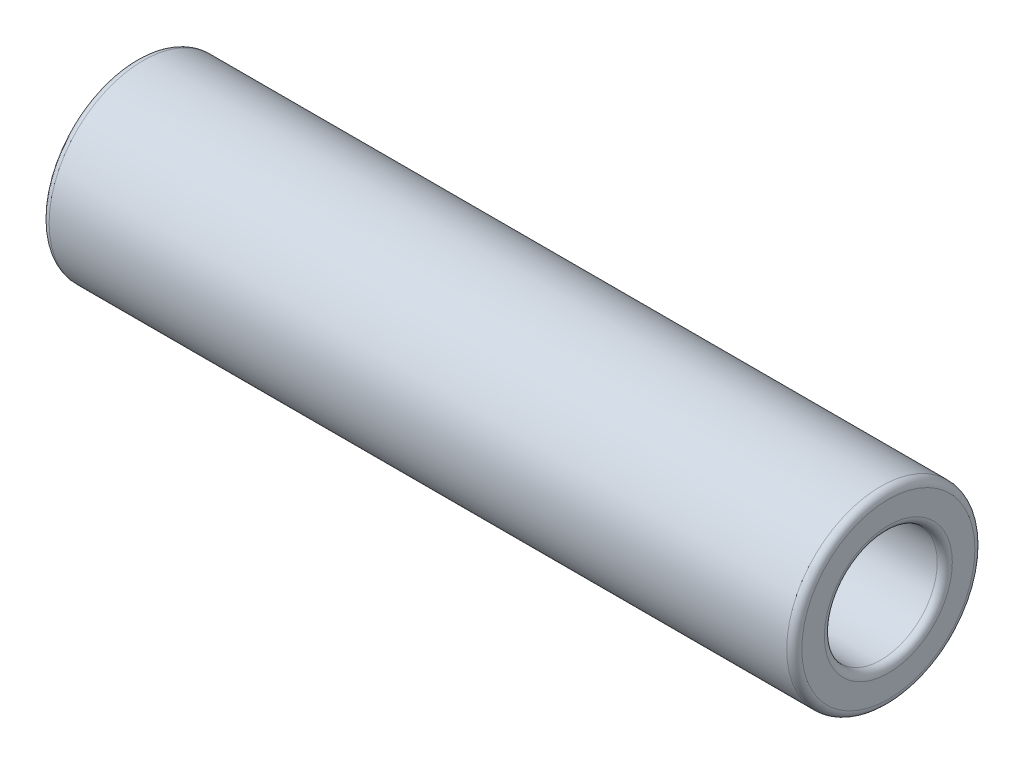
ISO-10303-21;
HEADER;
FILE_DESCRIPTION(('STEP AP214'),'2;1');
FILE_NAME('part.step','',(''),(''),'','','');
FILE_SCHEMA(('AUTOMOTIVE_DESIGN { 1 0 10303 214 1 1 1 1 }'));
ENDSEC;
DATA;
#1=APPLICATION_CONTEXT('core data for automotive mechanical design processes');
#2=APPLICATION_PROTOCOL_DEFINITION('international standard','automotive_design',2000,#1);
#3=PRODUCT_CONTEXT('',#1,'mechanical');
#4=PRODUCT('Part','Part','',(#3));
#5=PRODUCT_RELATED_PRODUCT_CATEGORY('part','',(#4));
#6=PRODUCT_DEFINITION_FORMATION('','',#4);
#7=PRODUCT_DEFINITION_CONTEXT('part definition',#1,'design');
#8=PRODUCT_DEFINITION('design','',#6,#7);
#9=PRODUCT_DEFINITION_SHAPE('','',#8);
#10=(LENGTH_UNIT() NAMED_UNIT(*) SI_UNIT(.MILLI.,.METRE.));
#11=(NAMED_UNIT(*) PLANE_ANGLE_UNIT() SI_UNIT($,.RADIAN.));
#12=(NAMED_UNIT(*) SI_UNIT($,.STERADIAN.) SOLID_ANGLE_UNIT());
#13=UNCERTAINTY_MEASURE_WITH_UNIT(LENGTH_MEASURE(1.E-05),#10,'distance_accuracy_value','');
#14=(GEOMETRIC_REPRESENTATION_CONTEXT(3) GLOBAL_UNCERTAINTY_ASSIGNED_CONTEXT((#13)) GLOBAL_UNIT_ASSIGNED_CONTEXT((#10,
#11,#12)) REPRESENTATION_CONTEXT('',''));
#15=CARTESIAN_POINT('',(0.,0.,0.));
#16=DIRECTION('',(0.,0.,1.));
#17=DIRECTION('',(1.,0.,0.));
#18=AXIS2_PLACEMENT_3D('',#15,#16,#17);
#19=CARTESIAN_POINT('',(50.,0.,0.));
#20=DIRECTION('',(1.,0.,0.));
#21=DIRECTION('',(0.,0.,-1.));
#22=AXIS2_PLACEMENT_3D('',#19,#20,#21);
#23=PLANE('',#22);
#24=CARTESIAN_POINT('',(50.,0.,0.));
#25=DIRECTION('',(1.,0.,0.));
#26=DIRECTION('',(0.,0.,-1.));
#27=AXIS2_PLACEMENT_3D('',#24,#25,#26);
#28=CIRCLE('',#27,4.25);
#29=CARTESIAN_POINT('',(50.,0.,-4.25));
#30=VERTEX_POINT('',#29);
#31=EDGE_CURVE('E10',#30,#30,#28,.F.);
#32=ORIENTED_EDGE('',*,*,#31,.T.);
#33=EDGE_LOOP('',(#32));
#34=FACE_BOUND('',#33,.T.);
#35=CARTESIAN_POINT('',(50.,0.,0.));
#36=DIRECTION('',(1.,0.,0.));
#37=DIRECTION('',(0.,0.,-1.));
#38=AXIS2_PLACEMENT_3D('',#35,#36,#37);
#39=CIRCLE('',#38,5.75);
#40=CARTESIAN_POINT('',(50.,0.,-5.75));
#41=VERTEX_POINT('',#40);
#42=EDGE_CURVE('E45',#41,#41,#39,.T.);
#43=ORIENTED_EDGE('',*,*,#42,.T.);
#44=EDGE_LOOP('',(#43));
#45=FACE_BOUND('',#44,.T.);
#46=ADVANCED_FACE('F38',(#34,#45),#23,.T.);
#47=CARTESIAN_POINT('',(0.,0.,0.));
#48=DIRECTION('',(1.,0.,0.));
#49=DIRECTION('',(0.,0.,-1.));
#50=AXIS2_PLACEMENT_3D('',#47,#48,#49);
#51=PLANE('',#50);
#52=CARTESIAN_POINT('',(0.,0.,0.));
#53=DIRECTION('',(1.,0.,0.));
#54=DIRECTION('',(0.,0.,-1.));
#55=AXIS2_PLACEMENT_3D('',#52,#53,#54);
#56=CIRCLE('',#55,4.25);
#57=CARTESIAN_POINT('',(0.,0.,-4.25));
#58=VERTEX_POINT('',#57);
#59=EDGE_CURVE('E64',#58,#58,#56,.T.);
#60=ORIENTED_EDGE('',*,*,#59,.T.);
#61=EDGE_LOOP('',(#60));
#62=FACE_BOUND('',#61,.T.);
#63=CARTESIAN_POINT('',(0.,0.,0.));
#64=DIRECTION('',(1.,0.,0.));
#65=DIRECTION('',(0.,0.,-1.));
#66=AXIS2_PLACEMENT_3D('',#63,#64,#65);
#67=CIRCLE('',#66,5.75);
#68=CARTESIAN_POINT('',(0.,0.,-5.75));
#69=VERTEX_POINT('',#68);
#70=EDGE_CURVE('E67',#69,#69,#67,.F.);
#71=ORIENTED_EDGE('',*,*,#70,.T.);
#72=EDGE_LOOP('',(#71));
#73=FACE_BOUND('',#72,.T.);
#74=ADVANCED_FACE('F71',(#62,#73),#51,.F.);
#75=CARTESIAN_POINT('',(50.,0.,0.));
#76=DIRECTION('',(-1.,0.,0.));
#77=DIRECTION('',(0.,0.,1.));
#78=AXIS2_PLACEMENT_3D('',#75,#76,#77);
#79=CYLINDRICAL_SURFACE('',#78,6.25);
#80=CARTESIAN_POINT('',(0.5,0.,0.));
#81=DIRECTION('',(1.,0.,0.));
#82=DIRECTION('',(0.,0.,-1.));
#83=AXIS2_PLACEMENT_3D('',#80,#81,#82);
#84=CIRCLE('',#83,6.25);
#85=CARTESIAN_POINT('',(0.5,0.,-6.25));
#86=VERTEX_POINT('',#85);
#87=EDGE_CURVE('E49',#86,#86,#84,.T.);
#88=ORIENTED_EDGE('',*,*,#87,.T.);
#89=EDGE_LOOP('',(#88));
#90=FACE_BOUND('',#89,.T.);
#91=CARTESIAN_POINT('',(49.5,0.,0.));
#92=DIRECTION('',(1.,0.,0.));
#93=DIRECTION('',(0.,0.,-1.));
#94=AXIS2_PLACEMENT_3D('',#91,#92,#93);
#95=CIRCLE('',#94,6.25);
#96=CARTESIAN_POINT('',(49.5,0.,-6.25));
#97=VERTEX_POINT('',#96);
#98=EDGE_CURVE('E53',#97,#97,#95,.F.);
#99=ORIENTED_EDGE('',*,*,#98,.T.);
#100=EDGE_LOOP('',(#99));
#101=FACE_BOUND('',#100,.T.);
#102=ADVANCED_FACE('F81',(#90,#101),#79,.T.);
#103=CARTESIAN_POINT('',(50.,0.,0.));
#104=DIRECTION('',(-1.,0.,0.));
#105=DIRECTION('',(0.,0.,1.));
#106=AXIS2_PLACEMENT_3D('',#103,#104,#105);
#107=CYLINDRICAL_SURFACE('',#106,3.75);
#108=CARTESIAN_POINT('',(0.5,0.,0.));
#109=DIRECTION('',(1.,0.,0.));
#110=DIRECTION('',(0.,0.,-1.));
#111=AXIS2_PLACEMENT_3D('',#108,#109,#110);
#112=CIRCLE('',#111,3.75);
#113=CARTESIAN_POINT('',(0.5,0.,-3.75));
#114=VERTEX_POINT('',#113);
#115=EDGE_CURVE('E58',#114,#114,#112,.F.);
#116=ORIENTED_EDGE('',*,*,#115,.T.);
#117=EDGE_LOOP('',(#116));
#118=FACE_BOUND('',#117,.T.);
#119=CARTESIAN_POINT('',(49.5,0.,0.));
#120=DIRECTION('',(1.,0.,0.));
#121=DIRECTION('',(0.,0.,-1.));
#122=AXIS2_PLACEMENT_3D('',#119,#120,#121);
#123=CIRCLE('',#122,3.75);
#124=CARTESIAN_POINT('',(49.5,0.,-3.75));
#125=VERTEX_POINT('',#124);
#126=EDGE_CURVE('E61',#125,#125,#123,.T.);
#127=ORIENTED_EDGE('',*,*,#126,.T.);
#128=EDGE_LOOP('',(#127));
#129=FACE_BOUND('',#128,.T.);
#130=ADVANCED_FACE('F84',(#118,#129),#107,.F.);
#131=CARTESIAN_POINT('',(0.5,0.,0.));
#132=DIRECTION('',(1.,0.,0.));
#133=DIRECTION('',(0.,0.,-1.));
#134=AXIS2_PLACEMENT_3D('',#131,#132,#133);
#135=TOROIDAL_SURFACE('',#134,4.25,0.5);
#136=ORIENTED_EDGE('',*,*,#115,.F.);
#137=EDGE_LOOP('',(#136));
#138=FACE_BOUND('',#137,.T.);
#139=ORIENTED_EDGE('',*,*,#59,.F.);
#140=EDGE_LOOP('',(#139));
#141=FACE_BOUND('',#140,.T.);
#142=ADVANCED_FACE('F77',(#138,#141),#135,.T.);
#143=CARTESIAN_POINT('',(0.5,0.,0.));
#144=DIRECTION('',(1.,0.,0.));
#145=DIRECTION('',(0.,0.,-1.));
#146=AXIS2_PLACEMENT_3D('',#143,#144,#145);
#147=TOROIDAL_SURFACE('',#146,5.75,0.5);
#148=ORIENTED_EDGE('',*,*,#70,.F.);
#149=EDGE_LOOP('',(#148));
#150=FACE_BOUND('',#149,.T.);
#151=ORIENTED_EDGE('',*,*,#87,.F.);
#152=EDGE_LOOP('',(#151));
#153=FACE_BOUND('',#152,.T.);
#154=ADVANCED_FACE('F73',(#150,#153),#147,.T.);
#155=CARTESIAN_POINT('',(49.5,0.,0.));
#156=DIRECTION('',(1.,0.,0.));
#157=DIRECTION('',(0.,0.,-1.));
#158=AXIS2_PLACEMENT_3D('',#155,#156,#157);
#159=TOROIDAL_SURFACE('',#158,4.25,0.5);
#160=ORIENTED_EDGE('',*,*,#31,.F.);
#161=EDGE_LOOP('',(#160));
#162=FACE_BOUND('',#161,.T.);
#163=ORIENTED_EDGE('',*,*,#126,.F.);
#164=EDGE_LOOP('',(#163));
#165=FACE_BOUND('',#164,.T.);
#166=ADVANCED_FACE('F76',(#162,#165),#159,.T.);
#167=CARTESIAN_POINT('',(49.5,0.,0.));
#168=DIRECTION('',(1.,0.,0.));
#169=DIRECTION('',(0.,0.,-1.));
#170=AXIS2_PLACEMENT_3D('',#167,#168,#169);
#171=TOROIDAL_SURFACE('',#170,5.75,0.5);
#172=ORIENTED_EDGE('',*,*,#98,.F.);
#173=EDGE_LOOP('',(#172));
#174=FACE_BOUND('',#173,.T.);
#175=ORIENTED_EDGE('',*,*,#42,.F.);
#176=EDGE_LOOP('',(#175));
#177=FACE_BOUND('',#176,.T.);
#178=ADVANCED_FACE('F40',(#174,#177),#171,.T.);
#179=CLOSED_SHELL('',(#46,#74,#102,#130,#142,#154,#166,#178));
#180=MANIFOLD_SOLID_BREP('B2',#179);
#181=ADVANCED_BREP_SHAPE_REPRESENTATION('',(#18,#180),#14);
#182=SHAPE_DEFINITION_REPRESENTATION(#9,#181);
ENDSEC;
END-ISO-10303-21;
